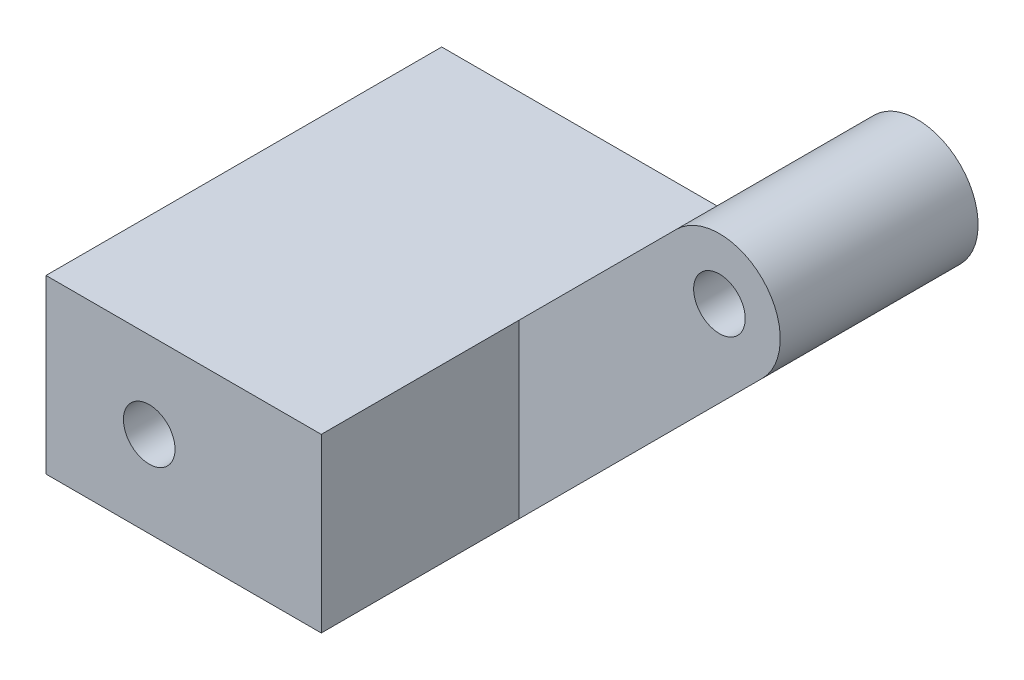
ISO-10303-21;
HEADER;
FILE_DESCRIPTION(('STEP AP214'),'2;1');
FILE_NAME('part.step','',(''),(''),'','','');
FILE_SCHEMA(('AUTOMOTIVE_DESIGN { 1 0 10303 214 1 1 1 1 }'));
ENDSEC;
DATA;
#1=APPLICATION_CONTEXT('core data for automotive mechanical design processes');
#2=APPLICATION_PROTOCOL_DEFINITION('international standard','automotive_design',2000,#1);
#3=PRODUCT_CONTEXT('',#1,'mechanical');
#4=PRODUCT('Part','Part','',(#3));
#5=PRODUCT_RELATED_PRODUCT_CATEGORY('part','',(#4));
#6=PRODUCT_DEFINITION_FORMATION('','',#4);
#7=PRODUCT_DEFINITION_CONTEXT('part definition',#1,'design');
#8=PRODUCT_DEFINITION('design','',#6,#7);
#9=PRODUCT_DEFINITION_SHAPE('','',#8);
#10=(LENGTH_UNIT() NAMED_UNIT(*) SI_UNIT(.MILLI.,.METRE.));
#11=(NAMED_UNIT(*) PLANE_ANGLE_UNIT() SI_UNIT($,.RADIAN.));
#12=(NAMED_UNIT(*) SI_UNIT($,.STERADIAN.) SOLID_ANGLE_UNIT());
#13=UNCERTAINTY_MEASURE_WITH_UNIT(LENGTH_MEASURE(1.E-05),#10,'distance_accuracy_value','');
#14=(GEOMETRIC_REPRESENTATION_CONTEXT(3) GLOBAL_UNCERTAINTY_ASSIGNED_CONTEXT((#13)) GLOBAL_UNIT_ASSIGNED_CONTEXT((#10,
#11,#12)) REPRESENTATION_CONTEXT('',''));
#15=CARTESIAN_POINT('',(0.,0.,0.));
#16=DIRECTION('',(0.,0.,1.));
#17=DIRECTION('',(1.,0.,0.));
#18=AXIS2_PLACEMENT_3D('',#15,#16,#17);
#19=CARTESIAN_POINT('',(8.00000000000004,-8.,23.));
#20=DIRECTION('',(-0.707106781186549,0.707106781186546,0.));
#21=DIRECTION('',(-0.707106781186546,-0.707106781186549,0.));
#22=AXIS2_PLACEMENT_3D('',#19,#20,#21);
#23=PLANE('',#22);
#24=DIRECTION('',(0.,0.,-1.));
#25=VECTOR('',#24,1.);
#26=CARTESIAN_POINT('',(30.1421356237309,14.142135623731,23.));
#27=LINE('',#26,#25);
#28=CARTESIAN_POINT('',(30.1421356237309,14.142135623731,11.5));
#29=VERTEX_POINT('',#28);
#30=CARTESIAN_POINT('',(30.1421356237309,14.142135623731,0.));
#31=VERTEX_POINT('',#30);
#32=EDGE_CURVE('E49',#29,#31,#27,.T.);
#33=ORIENTED_EDGE('',*,*,#32,.F.);
#34=DIRECTION('',(-0.707106781186546,-0.707106781186549,0.));
#35=VECTOR('',#34,1.);
#36=CARTESIAN_POINT('',(8.00000000000004,-8.,11.5));
#37=LINE('',#36,#35);
#38=CARTESIAN_POINT('',(16.,0.,11.5));
#39=VERTEX_POINT('',#38);
#40=EDGE_CURVE('E109',#29,#39,#37,.T.);
#41=ORIENTED_EDGE('',*,*,#40,.T.);
#42=DIRECTION('',(0.,0.,-1.));
#43=VECTOR('',#42,1.);
#44=CARTESIAN_POINT('',(16.,0.,23.));
#45=LINE('',#44,#43);
#46=CARTESIAN_POINT('',(16.,0.,0.));
#47=VERTEX_POINT('',#46);
#48=EDGE_CURVE('E85',#39,#47,#45,.T.);
#49=ORIENTED_EDGE('',*,*,#48,.T.);
#50=DIRECTION('',(0.707106781186546,0.707106781186549,0.));
#51=VECTOR('',#50,1.);
#52=CARTESIAN_POINT('',(8.00000000000004,-8.,0.));
#53=LINE('',#52,#51);
#54=EDGE_CURVE('E149',#47,#31,#53,.T.);
#55=ORIENTED_EDGE('',*,*,#54,.T.);
#56=EDGE_LOOP('',(#33,#41,#49,#55));
#57=FACE_BOUND('',#56,.T.);
#58=ADVANCED_FACE('F39',(#57),#23,.F.);
#59=CARTESIAN_POINT('',(27.6421356237309,16.642135623731,23.));
#60=DIRECTION('',(0.,0.,-1.));
#61=DIRECTION('',(-1.,0.,0.));
#62=AXIS2_PLACEMENT_3D('',#59,#60,#61);
#63=CYLINDRICAL_SURFACE('',#62,3.53553390593273);
#64=DIRECTION('',(0.,0.,-1.));
#65=VECTOR('',#64,1.);
#66=CARTESIAN_POINT('',(25.1421356237309,19.1421356237309,23.));
#67=LINE('',#66,#65);
#68=CARTESIAN_POINT('',(25.1421356237309,19.1421356237309,11.5));
#69=VERTEX_POINT('',#68);
#70=CARTESIAN_POINT('',(25.1421356237309,19.1421356237309,0.));
#71=VERTEX_POINT('',#70);
#72=EDGE_CURVE('E138',#69,#71,#67,.T.);
#73=ORIENTED_EDGE('',*,*,#72,.F.);
#74=CARTESIAN_POINT('',(27.6421356237309,16.642135623731,11.5));
#75=DIRECTION('',(0.,0.,-1.));
#76=DIRECTION('',(-1.,0.,0.));
#77=AXIS2_PLACEMENT_3D('',#74,#75,#76);
#78=CIRCLE('',#77,3.53553390593273);
#79=EDGE_CURVE('E122',#69,#29,#78,.T.);
#80=ORIENTED_EDGE('',*,*,#79,.T.);
#81=ORIENTED_EDGE('',*,*,#32,.T.);
#82=CARTESIAN_POINT('',(27.6421356237309,16.642135623731,0.));
#83=DIRECTION('',(0.,0.,1.));
#84=DIRECTION('',(1.,0.,0.));
#85=AXIS2_PLACEMENT_3D('',#82,#83,#84);
#86=CIRCLE('',#85,3.53553390593273);
#87=EDGE_CURVE('E145',#31,#71,#86,.T.);
#88=ORIENTED_EDGE('',*,*,#87,.T.);
#89=EDGE_LOOP('',(#73,#80,#81,#88));
#90=FACE_BOUND('',#89,.T.);
#91=ADVANCED_FACE('F144',(#90),#63,.T.);
#92=CARTESIAN_POINT('',(3.00000000000002,-3.00000000000001,23.));
#93=DIRECTION('',(-0.707106781186548,0.707106781186547,0.));
#94=DIRECTION('',(-0.707106781186547,-0.707106781186548,0.));
#95=AXIS2_PLACEMENT_3D('',#92,#93,#94);
#96=PLANE('',#95);
#97=DIRECTION('',(-0.707106781186547,-0.707106781186548,0.));
#98=VECTOR('',#97,1.);
#99=CARTESIAN_POINT('',(3.00000000000002,-3.00000000000001,11.5));
#100=LINE('',#99,#98);
#101=CARTESIAN_POINT('',(16.,10.,11.5));
#102=VERTEX_POINT('',#101);
#103=EDGE_CURVE('E112',#69,#102,#100,.T.);
#104=ORIENTED_EDGE('',*,*,#103,.F.);
#105=ORIENTED_EDGE('',*,*,#72,.T.);
#106=DIRECTION('',(0.707106781186547,0.707106781186549,0.));
#107=VECTOR('',#106,1.);
#108=CARTESIAN_POINT('',(3.00000000000002,-3.00000000000001,0.));
#109=LINE('',#108,#107);
#110=CARTESIAN_POINT('',(16.,10.,0.));
#111=VERTEX_POINT('',#110);
#112=EDGE_CURVE('E152',#111,#71,#109,.T.);
#113=ORIENTED_EDGE('',*,*,#112,.F.);
#114=DIRECTION('',(0.,0.,-1.));
#115=VECTOR('',#114,1.);
#116=CARTESIAN_POINT('',(16.,10.,23.));
#117=LINE('',#116,#115);
#118=EDGE_CURVE('E136',#102,#111,#117,.T.);
#119=ORIENTED_EDGE('',*,*,#118,.F.);
#120=EDGE_LOOP('',(#104,#105,#113,#119));
#121=FACE_BOUND('',#120,.T.);
#122=ADVANCED_FACE('F197',(#121),#96,.T.);
#123=CARTESIAN_POINT('',(0.,10.,23.));
#124=DIRECTION('',(0.,1.,0.));
#125=DIRECTION('',(0.,0.,1.));
#126=AXIS2_PLACEMENT_3D('',#123,#124,#125);
#127=PLANE('',#126);
#128=DIRECTION('',(1.,0.,0.));
#129=VECTOR('',#128,1.);
#130=CARTESIAN_POINT('',(0.,10.,0.));
#131=LINE('',#130,#129);
#132=CARTESIAN_POINT('',(0.,10.,0.));
#133=VERTEX_POINT('',#132);
#134=EDGE_CURVE('E161',#133,#111,#131,.T.);
#135=ORIENTED_EDGE('',*,*,#134,.F.);
#136=DIRECTION('',(0.,0.,-1.));
#137=VECTOR('',#136,1.);
#138=CARTESIAN_POINT('',(0.,10.,23.));
#139=LINE('',#138,#137);
#140=CARTESIAN_POINT('',(0.,10.,23.));
#141=VERTEX_POINT('',#140);
#142=EDGE_CURVE('E134',#141,#133,#139,.T.);
#143=ORIENTED_EDGE('',*,*,#142,.F.);
#144=DIRECTION('',(1.,0.,0.));
#145=VECTOR('',#144,1.);
#146=CARTESIAN_POINT('',(0.,10.,23.));
#147=LINE('',#146,#145);
#148=CARTESIAN_POINT('',(16.,10.,23.));
#149=VERTEX_POINT('',#148);
#150=EDGE_CURVE('E166',#141,#149,#147,.T.);
#151=ORIENTED_EDGE('',*,*,#150,.T.);
#152=EDGE_CURVE('E90',#149,#102,#117,.T.);
#153=ORIENTED_EDGE('',*,*,#152,.T.);
#154=ORIENTED_EDGE('',*,*,#118,.T.);
#155=EDGE_LOOP('',(#135,#143,#151,#153,#154));
#156=FACE_BOUND('',#155,.T.);
#157=ADVANCED_FACE('F202',(#156),#127,.T.);
#158=CARTESIAN_POINT('',(0.,0.,23.));
#159=DIRECTION('',(-1.,0.,0.));
#160=DIRECTION('',(0.,0.,1.));
#161=AXIS2_PLACEMENT_3D('',#158,#159,#160);
#162=PLANE('',#161);
#163=DIRECTION('',(0.,1.,0.));
#164=VECTOR('',#163,1.);
#165=CARTESIAN_POINT('',(0.,0.,0.));
#166=LINE('',#165,#164);
#167=CARTESIAN_POINT('',(0.,0.,0.));
#168=VERTEX_POINT('',#167);
#169=EDGE_CURVE('E162',#168,#133,#166,.T.);
#170=ORIENTED_EDGE('',*,*,#169,.F.);
#171=DIRECTION('',(0.,0.,-1.));
#172=VECTOR('',#171,1.);
#173=CARTESIAN_POINT('',(0.,0.,23.));
#174=LINE('',#173,#172);
#175=CARTESIAN_POINT('',(0.,0.,23.));
#176=VERTEX_POINT('',#175);
#177=EDGE_CURVE('E57',#176,#168,#174,.T.);
#178=ORIENTED_EDGE('',*,*,#177,.F.);
#179=DIRECTION('',(0.,1.,0.));
#180=VECTOR('',#179,1.);
#181=CARTESIAN_POINT('',(0.,0.,23.));
#182=LINE('',#181,#180);
#183=EDGE_CURVE('E128',#176,#141,#182,.T.);
#184=ORIENTED_EDGE('',*,*,#183,.T.);
#185=ORIENTED_EDGE('',*,*,#142,.T.);
#186=EDGE_LOOP('',(#170,#178,#184,#185));
#187=FACE_BOUND('',#186,.T.);
#188=ADVANCED_FACE('F189',(#187),#162,.T.);
#189=CARTESIAN_POINT('',(6.,5.,23.));
#190=DIRECTION('',(0.,0.,-1.));
#191=DIRECTION('',(-1.,0.,0.));
#192=AXIS2_PLACEMENT_3D('',#189,#190,#191);
#193=CYLINDRICAL_SURFACE('',#192,1.5);
#194=CARTESIAN_POINT('',(6.,5.,23.));
#195=DIRECTION('',(0.,0.,1.));
#196=DIRECTION('',(1.,0.,0.));
#197=AXIS2_PLACEMENT_3D('',#194,#195,#196);
#198=CIRCLE('',#197,1.5);
#199=CARTESIAN_POINT('',(7.5,5.,23.));
#200=VERTEX_POINT('',#199);
#201=EDGE_CURVE('E164',#200,#200,#198,.T.);
#202=ORIENTED_EDGE('',*,*,#201,.T.);
#203=EDGE_LOOP('',(#202));
#204=FACE_BOUND('',#203,.T.);
#205=CARTESIAN_POINT('',(6.,5.,0.));
#206=DIRECTION('',(0.,0.,1.));
#207=DIRECTION('',(1.,0.,0.));
#208=AXIS2_PLACEMENT_3D('',#205,#206,#207);
#209=CIRCLE('',#208,1.5);
#210=CARTESIAN_POINT('',(7.5,5.,0.));
#211=VERTEX_POINT('',#210);
#212=EDGE_CURVE('E154',#211,#211,#209,.T.);
#213=ORIENTED_EDGE('',*,*,#212,.F.);
#214=EDGE_LOOP('',(#213));
#215=FACE_BOUND('',#214,.T.);
#216=ADVANCED_FACE('F180',(#204,#215),#193,.F.);
#217=CARTESIAN_POINT('',(27.6421356237309,16.642135623731,23.));
#218=DIRECTION('',(0.,0.,-1.));
#219=DIRECTION('',(-1.,0.,0.));
#220=AXIS2_PLACEMENT_3D('',#217,#218,#219);
#221=CYLINDRICAL_SURFACE('',#220,1.5);
#222=CARTESIAN_POINT('',(27.6421356237309,16.642135623731,11.5));
#223=DIRECTION('',(0.,0.,-1.));
#224=DIRECTION('',(-1.,0.,0.));
#225=AXIS2_PLACEMENT_3D('',#222,#223,#224);
#226=CIRCLE('',#225,1.5);
#227=CARTESIAN_POINT('',(26.1421356237309,16.642135623731,11.5));
#228=VERTEX_POINT('',#227);
#229=EDGE_CURVE('E43',#228,#228,#226,.T.);
#230=ORIENTED_EDGE('',*,*,#229,.F.);
#231=EDGE_LOOP('',(#230));
#232=FACE_BOUND('',#231,.T.);
#233=CARTESIAN_POINT('',(27.6421356237309,16.642135623731,0.));
#234=DIRECTION('',(0.,0.,1.));
#235=DIRECTION('',(1.,0.,0.));
#236=AXIS2_PLACEMENT_3D('',#233,#234,#235);
#237=CIRCLE('',#236,1.5);
#238=CARTESIAN_POINT('',(29.1421356237309,16.642135623731,0.));
#239=VERTEX_POINT('',#238);
#240=EDGE_CURVE('E121',#239,#239,#237,.T.);
#241=ORIENTED_EDGE('',*,*,#240,.F.);
#242=EDGE_LOOP('',(#241));
#243=FACE_BOUND('',#242,.T.);
#244=ADVANCED_FACE('F41',(#232,#243),#221,.F.);
#245=CARTESIAN_POINT('',(0.,0.,23.));
#246=DIRECTION('',(0.,1.,0.));
#247=DIRECTION('',(0.,0.,1.));
#248=AXIS2_PLACEMENT_3D('',#245,#246,#247);
#249=PLANE('',#248);
#250=DIRECTION('',(1.,0.,0.));
#251=VECTOR('',#250,1.);
#252=CARTESIAN_POINT('',(0.,0.,0.));
#253=LINE('',#252,#251);
#254=EDGE_CURVE('E125',#168,#47,#253,.T.);
#255=ORIENTED_EDGE('',*,*,#254,.T.);
#256=ORIENTED_EDGE('',*,*,#48,.F.);
#257=CARTESIAN_POINT('',(16.,0.,23.));
#258=VERTEX_POINT('',#257);
#259=EDGE_CURVE('E116',#258,#39,#45,.T.);
#260=ORIENTED_EDGE('',*,*,#259,.F.);
#261=DIRECTION('',(1.,0.,0.));
#262=VECTOR('',#261,1.);
#263=CARTESIAN_POINT('',(0.,0.,23.));
#264=LINE('',#263,#262);
#265=EDGE_CURVE('E127',#176,#258,#264,.T.);
#266=ORIENTED_EDGE('',*,*,#265,.F.);
#267=ORIENTED_EDGE('',*,*,#177,.T.);
#268=EDGE_LOOP('',(#255,#256,#260,#266,#267));
#269=FACE_BOUND('',#268,.T.);
#270=ADVANCED_FACE('F124',(#269),#249,.F.);
#271=CARTESIAN_POINT('',(0.,0.,23.));
#272=DIRECTION('',(0.,0.,1.));
#273=DIRECTION('',(1.,0.,0.));
#274=AXIS2_PLACEMENT_3D('',#271,#272,#273);
#275=PLANE('',#274);
#276=DIRECTION('',(0.,-1.,0.));
#277=VECTOR('',#276,1.);
#278=CARTESIAN_POINT('',(16.,0.,23.));
#279=LINE('',#278,#277);
#280=EDGE_CURVE('E11',#149,#258,#279,.T.);
#281=ORIENTED_EDGE('',*,*,#280,.F.);
#282=ORIENTED_EDGE('',*,*,#150,.F.);
#283=ORIENTED_EDGE('',*,*,#183,.F.);
#284=ORIENTED_EDGE('',*,*,#265,.T.);
#285=EDGE_LOOP('',(#281,#282,#283,#284));
#286=FACE_BOUND('',#285,.T.);
#287=ORIENTED_EDGE('',*,*,#201,.F.);
#288=EDGE_LOOP('',(#287));
#289=FACE_BOUND('',#288,.T.);
#290=ADVANCED_FACE('F186',(#286,#289),#275,.T.);
#291=CARTESIAN_POINT('',(0.,0.,0.));
#292=DIRECTION('',(0.,0.,1.));
#293=DIRECTION('',(1.,0.,0.));
#294=AXIS2_PLACEMENT_3D('',#291,#292,#293);
#295=PLANE('',#294);
#296=ORIENTED_EDGE('',*,*,#240,.T.);
#297=EDGE_LOOP('',(#296));
#298=FACE_BOUND('',#297,.T.);
#299=ORIENTED_EDGE('',*,*,#212,.T.);
#300=EDGE_LOOP('',(#299));
#301=FACE_BOUND('',#300,.T.);
#302=ORIENTED_EDGE('',*,*,#54,.F.);
#303=ORIENTED_EDGE('',*,*,#254,.F.);
#304=ORIENTED_EDGE('',*,*,#169,.T.);
#305=ORIENTED_EDGE('',*,*,#134,.T.);
#306=ORIENTED_EDGE('',*,*,#112,.T.);
#307=ORIENTED_EDGE('',*,*,#87,.F.);
#308=EDGE_LOOP('',(#302,#303,#304,#305,#306,#307));
#309=FACE_BOUND('',#308,.T.);
#310=ADVANCED_FACE('F148',(#298,#301,#309),#295,.F.);
#311=CARTESIAN_POINT('',(0.,0.,11.5));
#312=DIRECTION('',(0.,0.,-1.));
#313=DIRECTION('',(-1.,0.,0.));
#314=AXIS2_PLACEMENT_3D('',#311,#312,#313);
#315=PLANE('',#314);
#316=ORIENTED_EDGE('',*,*,#229,.T.);
#317=EDGE_LOOP('',(#316));
#318=FACE_BOUND('',#317,.T.);
#319=ORIENTED_EDGE('',*,*,#79,.F.);
#320=ORIENTED_EDGE('',*,*,#103,.T.);
#321=DIRECTION('',(0.,-1.,0.));
#322=VECTOR('',#321,1.);
#323=CARTESIAN_POINT('',(16.,0.,11.5));
#324=LINE('',#323,#322);
#325=EDGE_CURVE('E106',#102,#39,#324,.T.);
#326=ORIENTED_EDGE('',*,*,#325,.T.);
#327=ORIENTED_EDGE('',*,*,#40,.F.);
#328=EDGE_LOOP('',(#319,#320,#326,#327));
#329=FACE_BOUND('',#328,.T.);
#330=ADVANCED_FACE('F108',(#318,#329),#315,.F.);
#331=CARTESIAN_POINT('',(16.,0.,11.5));
#332=DIRECTION('',(-1.,0.,0.));
#333=DIRECTION('',(0.,0.,1.));
#334=AXIS2_PLACEMENT_3D('',#331,#332,#333);
#335=PLANE('',#334);
#336=ORIENTED_EDGE('',*,*,#152,.F.);
#337=ORIENTED_EDGE('',*,*,#280,.T.);
#338=ORIENTED_EDGE('',*,*,#259,.T.);
#339=ORIENTED_EDGE('',*,*,#325,.F.);
#340=EDGE_LOOP('',(#336,#337,#338,#339));
#341=FACE_BOUND('',#340,.T.);
#342=ADVANCED_FACE('F117',(#341),#335,.F.);
#343=CLOSED_SHELL('',(#58,#91,#122,#157,#188,#216,#244,#270,#290,#310,#330,#342));
#344=MANIFOLD_SOLID_BREP('B2',#343);
#345=ADVANCED_BREP_SHAPE_REPRESENTATION('',(#18,#344),#14);
#346=SHAPE_DEFINITION_REPRESENTATION(#9,#345);
ENDSEC;
END-ISO-10303-21;
